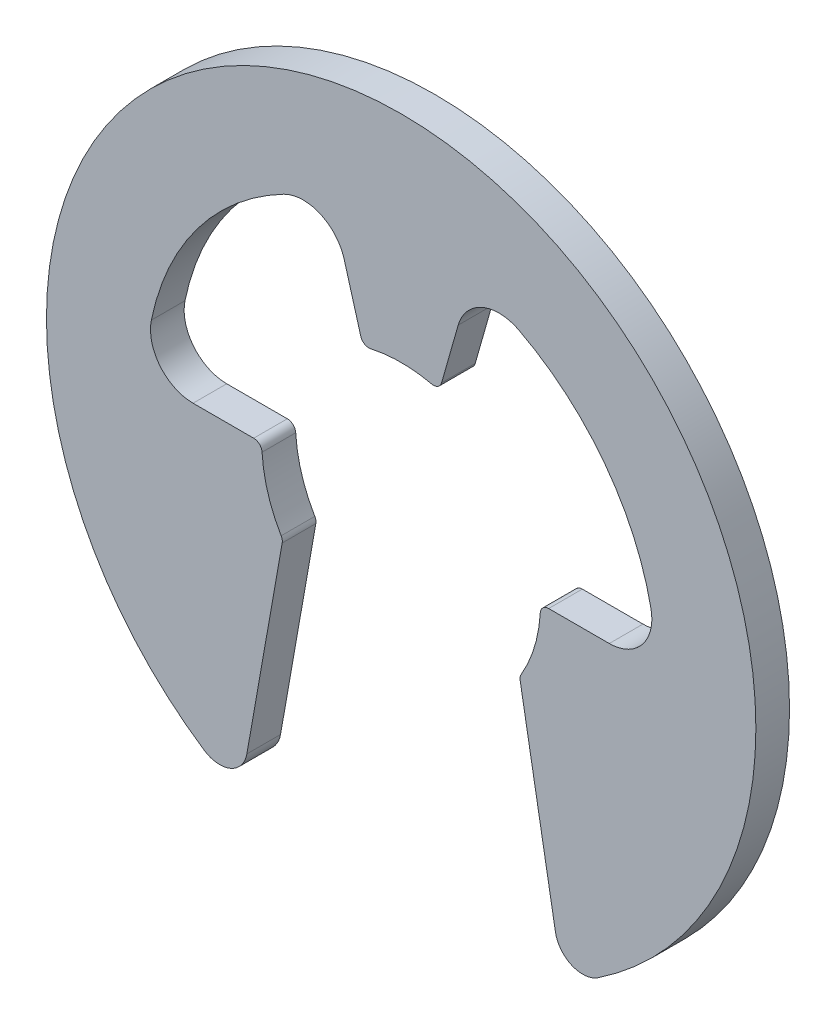
ISO-10303-21;
HEADER;
FILE_DESCRIPTION(('STEP AP214'),'2;1');
FILE_NAME('part.step','',(''),(''),'','','');
FILE_SCHEMA(('AUTOMOTIVE_DESIGN { 1 0 10303 214 1 1 1 1 }'));
ENDSEC;
DATA;
#1=APPLICATION_CONTEXT('core data for automotive mechanical design processes');
#2=APPLICATION_PROTOCOL_DEFINITION('international standard','automotive_design',2000,#1);
#3=PRODUCT_CONTEXT('',#1,'mechanical');
#4=PRODUCT('Part','Part','',(#3));
#5=PRODUCT_RELATED_PRODUCT_CATEGORY('part','',(#4));
#6=PRODUCT_DEFINITION_FORMATION('','',#4);
#7=PRODUCT_DEFINITION_CONTEXT('part definition',#1,'design');
#8=PRODUCT_DEFINITION('design','',#6,#7);
#9=PRODUCT_DEFINITION_SHAPE('','',#8);
#10=(LENGTH_UNIT() NAMED_UNIT(*) SI_UNIT(.MILLI.,.METRE.));
#11=(NAMED_UNIT(*) PLANE_ANGLE_UNIT() SI_UNIT($,.RADIAN.));
#12=(NAMED_UNIT(*) SI_UNIT($,.STERADIAN.) SOLID_ANGLE_UNIT());
#13=UNCERTAINTY_MEASURE_WITH_UNIT(LENGTH_MEASURE(1.E-05),#10,'distance_accuracy_value','');
#14=(GEOMETRIC_REPRESENTATION_CONTEXT(3) GLOBAL_UNCERTAINTY_ASSIGNED_CONTEXT((#13)) GLOBAL_UNIT_ASSIGNED_CONTEXT((#10,
#11,#12)) REPRESENTATION_CONTEXT('',''));
#15=CARTESIAN_POINT('',(0.,0.,0.));
#16=DIRECTION('',(0.,0.,1.));
#17=DIRECTION('',(1.,0.,0.));
#18=AXIS2_PLACEMENT_3D('',#15,#16,#17);
#19=CARTESIAN_POINT('',(-6.6929,0.,0.317500000000002));
#20=DIRECTION('',(0.,0.,1.));
#21=DIRECTION('',(1.,0.,0.));
#22=AXIS2_PLACEMENT_3D('',#19,#20,#21);
#23=PLANE('',#22);
#24=CARTESIAN_POINT('',(0.,0.,0.317500000000001));
#25=DIRECTION('',(0.,0.,1.));
#26=DIRECTION('',(-1.,0.,0.));
#27=AXIS2_PLACEMENT_3D('',#24,#25,#26);
#28=CIRCLE('',#27,2.6289);
#29=CARTESIAN_POINT('',(2.26450522532689,-1.33533939298862,0.317500000000001));
#30=VERTEX_POINT('',#29);
#31=CARTESIAN_POINT('',(2.62463373739829,-0.149709567198178,0.317500000000001));
#32=VERTEX_POINT('',#31);
#33=EDGE_CURVE('E349',#30,#32,#28,.T.);
#34=ORIENTED_EDGE('',*,*,#33,.F.);
#35=CARTESIAN_POINT('',(2.40125070994808,-1.41597582976329,0.3175));
#36=DIRECTION('',(0.,0.,1.));
#37=DIRECTION('',(1.,0.,0.));
#38=AXIS2_PLACEMENT_3D('',#35,#36,#37);
#39=CIRCLE('',#38,0.15875);
#40=CARTESIAN_POINT('',(2.24491247915739,-1.44354247796792,0.317500000000001));
#41=VERTEX_POINT('',#40);
#42=EDGE_CURVE('E293',#30,#41,#39,.T.);
#43=ORIENTED_EDGE('',*,*,#42,.T.);
#44=DIRECTION('',(-0.173648177666931,0.984807753012208,0.));
#45=VECTOR('',#44,1.);
#46=CARTESIAN_POINT('',(2.234565,-1.38485900754373,0.317500000000001));
#47=LINE('',#46,#45);
#48=CARTESIAN_POINT('',(2.911405825242,-5.22341407451373,0.317500000000001));
#49=VERTEX_POINT('',#48);
#50=EDGE_CURVE('E341',#49,#41,#47,.T.);
#51=ORIENTED_EDGE('',*,*,#50,.F.);
#52=CARTESIAN_POINT('',(3.42552097043256,-5.13276170322578,0.3175));
#53=DIRECTION('',(0.,0.,1.));
#54=DIRECTION('',(1.,0.,0.));
#55=AXIS2_PLACEMENT_3D('',#52,#53,#54);
#56=CIRCLE('',#55,0.5220462);
#57=CARTESIAN_POINT('',(3.71531558615245,-5.56698666293468,0.317499999999999));
#58=VERTEX_POINT('',#57);
#59=EDGE_CURVE('E264',#49,#58,#56,.T.);
#60=ORIENTED_EDGE('',*,*,#59,.T.);
#61=CARTESIAN_POINT('',(0.,0.,0.3175));
#62=DIRECTION('',(0.,0.,-1.));
#63=DIRECTION('',(-1.,0.,0.));
#64=AXIS2_PLACEMENT_3D('',#61,#62,#63);
#65=CIRCLE('',#64,6.6929);
#66=CARTESIAN_POINT('',(-3.71531558615245,-5.56698666293468,0.317500000000001));
#67=VERTEX_POINT('',#66);
#68=EDGE_CURVE('E228',#67,#58,#65,.T.);
#69=ORIENTED_EDGE('',*,*,#68,.F.);
#70=CARTESIAN_POINT('',(-3.42552097043256,-5.13276170322578,0.317500000000001));
#71=DIRECTION('',(0.,0.,1.));
#72=DIRECTION('',(1.,0.,0.));
#73=AXIS2_PLACEMENT_3D('',#70,#71,#72);
#74=CIRCLE('',#73,0.5220462);
#75=CARTESIAN_POINT('',(-2.911405825242,-5.22341407451373,0.317500000000001));
#76=VERTEX_POINT('',#75);
#77=EDGE_CURVE('E261',#67,#76,#74,.T.);
#78=ORIENTED_EDGE('',*,*,#77,.T.);
#79=DIRECTION('',(-0.173648177666931,-0.984807753012208,0.));
#80=VECTOR('',#79,1.);
#81=CARTESIAN_POINT('',(-2.234565,-1.38485900754373,0.317500000000001));
#82=LINE('',#81,#80);
#83=CARTESIAN_POINT('',(-2.24491247915739,-1.44354247796792,0.317500000000001));
#84=VERTEX_POINT('',#83);
#85=EDGE_CURVE('E338',#84,#76,#82,.T.);
#86=ORIENTED_EDGE('',*,*,#85,.F.);
#87=CARTESIAN_POINT('',(-2.40125070994808,-1.41597582976329,0.317500000000001));
#88=DIRECTION('',(0.,0.,1.));
#89=DIRECTION('',(1.,0.,0.));
#90=AXIS2_PLACEMENT_3D('',#87,#88,#89);
#91=CIRCLE('',#90,0.15875);
#92=CARTESIAN_POINT('',(-2.26450522532689,-1.33533939298862,0.317500000000001));
#93=VERTEX_POINT('',#92);
#94=EDGE_CURVE('E285',#84,#93,#91,.T.);
#95=ORIENTED_EDGE('',*,*,#94,.T.);
#96=CARTESIAN_POINT('',(0.,0.,0.317500000000001));
#97=DIRECTION('',(0.,0.,1.));
#98=DIRECTION('',(1.,0.,0.));
#99=AXIS2_PLACEMENT_3D('',#96,#97,#98);
#100=CIRCLE('',#99,2.62890000000003);
#101=CARTESIAN_POINT('',(-2.62463373739829,-0.149709567198178,0.317500000000001));
#102=VERTEX_POINT('',#101);
#103=EDGE_CURVE('E329',#102,#93,#100,.T.);
#104=ORIENTED_EDGE('',*,*,#103,.F.);
#105=CARTESIAN_POINT('',(-2.78312611284505,-0.158750000000001,0.317500000000001));
#106=DIRECTION('',(0.,0.,1.));
#107=DIRECTION('',(1.,0.,0.));
#108=AXIS2_PLACEMENT_3D('',#105,#106,#107);
#109=CIRCLE('',#108,0.15875);
#110=CARTESIAN_POINT('',(-2.78312611284505,0.,0.317500000000001));
#111=VERTEX_POINT('',#110);
#112=EDGE_CURVE('E283',#102,#111,#109,.T.);
#113=ORIENTED_EDGE('',*,*,#112,.T.);
#114=DIRECTION('',(1.,0.,0.));
#115=VECTOR('',#114,1.);
#116=CARTESIAN_POINT('',(-4.81125161290323,0.,0.317500000000001));
#117=LINE('',#116,#115);
#118=CARTESIAN_POINT('',(-3.92681141154804,0.,0.317500000000001));
#119=VERTEX_POINT('',#118);
#120=EDGE_CURVE('E339',#119,#111,#117,.T.);
#121=ORIENTED_EDGE('',*,*,#120,.F.);
#122=CARTESIAN_POINT('',(-3.92681141154804,0.803148,0.317500000000001));
#123=DIRECTION('',(0.,0.,1.));
#124=DIRECTION('',(1.,0.,0.));
#125=AXIS2_PLACEMENT_3D('',#122,#123,#124);
#126=CIRCLE('',#125,0.803148);
#127=CARTESIAN_POINT('',(-4.71366999509587,0.964083637448945,0.317500000000001));
#128=VERTEX_POINT('',#127);
#129=EDGE_CURVE('E254',#119,#128,#126,.F.);
#130=ORIENTED_EDGE('',*,*,#129,.T.);
#131=CARTESIAN_POINT('',(0.,0.,0.317500000000001));
#132=DIRECTION('',(0.,0.,1.));
#133=DIRECTION('',(1.,0.,0.));
#134=AXIS2_PLACEMENT_3D('',#131,#132,#133);
#135=CIRCLE('',#134,4.81125161290323);
#136=CARTESIAN_POINT('',(-2.21811764416981,4.26943745700607,0.317500000000001));
#137=VERTEX_POINT('',#136);
#138=EDGE_CURVE('E343',#137,#128,#135,.T.);
#139=ORIENTED_EDGE('',*,*,#138,.F.);
#140=CARTESIAN_POINT('',(-1.84784460650494,3.55673514363643,0.317500000000001));
#141=DIRECTION('',(0.,0.,1.));
#142=DIRECTION('',(1.,0.,0.));
#143=AXIS2_PLACEMENT_3D('',#140,#141,#142);
#144=CIRCLE('',#143,0.803148);
#145=CARTESIAN_POINT('',(-1.07540159458678,3.77668628194401,0.317500000000001));
#146=VERTEX_POINT('',#145);
#147=EDGE_CURVE('E249',#137,#146,#144,.F.);
#148=ORIENTED_EDGE('',*,*,#147,.T.);
#149=DIRECTION('',(-0.273861278752583,0.961769203083567,0.));
#150=VECTOR('',#149,1.);
#151=CARTESIAN_POINT('',(-0.719953915712665,2.52839505798639,0.317500000000001));
#152=LINE('',#151,#150);
#153=CARTESIAN_POINT('',(-0.762190476193451,2.67672498363205,0.317500000000001));
#154=VERTEX_POINT('',#153);
#155=EDGE_CURVE('E443',#154,#146,#152,.T.);
#156=ORIENTED_EDGE('',*,*,#155,.F.);
#157=CARTESIAN_POINT('',(-0.609509615203935,2.72020046163402,0.317500000000001));
#158=DIRECTION('',(0.,0.,1.));
#159=DIRECTION('',(1.,0.,0.));
#160=AXIS2_PLACEMENT_3D('',#157,#158,#159);
#161=CIRCLE('',#160,0.15875);
#162=CARTESIAN_POINT('',(-0.57479950044289,2.56529155151819,0.317500000000001));
#163=VERTEX_POINT('',#162);
#164=EDGE_CURVE('E287',#154,#163,#161,.T.);
#165=ORIENTED_EDGE('',*,*,#164,.T.);
#166=CARTESIAN_POINT('',(0.,0.,0.317500000000001));
#167=DIRECTION('',(0.,0.,1.));
#168=DIRECTION('',(-1.,0.,0.));
#169=AXIS2_PLACEMENT_3D('',#166,#167,#168);
#170=CIRCLE('',#169,2.6289);
#171=CARTESIAN_POINT('',(0.57479950044289,2.56529155151819,0.317500000000001));
#172=VERTEX_POINT('',#171);
#173=EDGE_CURVE('E433',#172,#163,#170,.T.);
#174=ORIENTED_EDGE('',*,*,#173,.F.);
#175=CARTESIAN_POINT('',(0.609509615203935,2.72020046163402,0.317500000000001));
#176=DIRECTION('',(0.,0.,1.));
#177=DIRECTION('',(1.,0.,0.));
#178=AXIS2_PLACEMENT_3D('',#175,#176,#177);
#179=CIRCLE('',#178,0.15875);
#180=CARTESIAN_POINT('',(0.762190476193451,2.67672498363205,0.317500000000001));
#181=VERTEX_POINT('',#180);
#182=EDGE_CURVE('E289',#172,#181,#179,.T.);
#183=ORIENTED_EDGE('',*,*,#182,.T.);
#184=DIRECTION('',(-0.273861278752583,-0.961769203083567,0.));
#185=VECTOR('',#184,1.);
#186=CARTESIAN_POINT('',(0.719953915712665,2.52839505798639,0.317500000000001));
#187=LINE('',#186,#185);
#188=CARTESIAN_POINT('',(1.07540159458678,3.77668628194401,0.317500000000001));
#189=VERTEX_POINT('',#188);
#190=EDGE_CURVE('E356',#189,#181,#187,.T.);
#191=ORIENTED_EDGE('',*,*,#190,.F.);
#192=CARTESIAN_POINT('',(1.84784460650494,3.55673514363643,0.3175));
#193=DIRECTION('',(0.,0.,1.));
#194=DIRECTION('',(1.,0.,0.));
#195=AXIS2_PLACEMENT_3D('',#192,#193,#194);
#196=CIRCLE('',#195,0.803148);
#197=CARTESIAN_POINT('',(2.21811764416981,4.26943745700607,0.317500000000001));
#198=VERTEX_POINT('',#197);
#199=EDGE_CURVE('E209',#189,#198,#196,.F.);
#200=ORIENTED_EDGE('',*,*,#199,.T.);
#201=CARTESIAN_POINT('',(0.,0.,0.317500000000001));
#202=DIRECTION('',(0.,0.,1.));
#203=DIRECTION('',(1.,0.,0.));
#204=AXIS2_PLACEMENT_3D('',#201,#202,#203);
#205=CIRCLE('',#204,4.81125161290323);
#206=CARTESIAN_POINT('',(4.71366999509587,0.964083637448945,0.317500000000001));
#207=VERTEX_POINT('',#206);
#208=EDGE_CURVE('E354',#207,#198,#205,.T.);
#209=ORIENTED_EDGE('',*,*,#208,.F.);
#210=CARTESIAN_POINT('',(3.92681141154804,0.803148,0.3175));
#211=DIRECTION('',(0.,0.,1.));
#212=DIRECTION('',(1.,0.,0.));
#213=AXIS2_PLACEMENT_3D('',#210,#211,#212);
#214=CIRCLE('',#213,0.803148);
#215=CARTESIAN_POINT('',(3.92681141154804,0.,0.317500000000001));
#216=VERTEX_POINT('',#215);
#217=EDGE_CURVE('E210',#207,#216,#214,.F.);
#218=ORIENTED_EDGE('',*,*,#217,.T.);
#219=DIRECTION('',(1.,0.,0.));
#220=VECTOR('',#219,1.);
#221=CARTESIAN_POINT('',(4.81125161290323,0.,0.317500000000001));
#222=LINE('',#221,#220);
#223=CARTESIAN_POINT('',(2.78312611284505,0.,0.317500000000001));
#224=VERTEX_POINT('',#223);
#225=EDGE_CURVE('E352',#224,#216,#222,.T.);
#226=ORIENTED_EDGE('',*,*,#225,.F.);
#227=CARTESIAN_POINT('',(2.78312611284505,-0.158750000000001,0.3175));
#228=DIRECTION('',(0.,0.,1.));
#229=DIRECTION('',(1.,0.,0.));
#230=AXIS2_PLACEMENT_3D('',#227,#228,#229);
#231=CIRCLE('',#230,0.15875);
#232=EDGE_CURVE('E291',#224,#32,#231,.T.);
#233=ORIENTED_EDGE('',*,*,#232,.T.);
#234=EDGE_LOOP('',(#34,#43,#51,#60,#69,#78,#86,#95,#104,#113,#121,#130,#139,#148,#156,#165,#174,
#183,#191,#200,#209,#218,#226,#233));
#235=FACE_BOUND('',#234,.T.);
#236=ADVANCED_FACE('F37',(#235),#23,.T.);
#237=CARTESIAN_POINT('',(0.,0.,-0.317500000000001));
#238=DIRECTION('',(0.,0.,-1.));
#239=DIRECTION('',(-1.,0.,0.));
#240=AXIS2_PLACEMENT_3D('',#237,#238,#239);
#241=CYLINDRICAL_SURFACE('',#240,6.6929);
#242=ORIENTED_EDGE('',*,*,#68,.T.);
#243=DIRECTION('',(0.,0.,-1.));
#244=VECTOR('',#243,1.);
#245=CARTESIAN_POINT('',(3.71531558615245,-5.56698666293468,-0.317500000000002));
#246=LINE('',#245,#244);
#247=CARTESIAN_POINT('',(3.71531558615245,-5.56698666293468,-0.317500000000001));
#248=VERTEX_POINT('',#247);
#249=EDGE_CURVE('E269',#58,#248,#246,.T.);
#250=ORIENTED_EDGE('',*,*,#249,.T.);
#251=CARTESIAN_POINT('',(0.,0.,-0.3175));
#252=DIRECTION('',(0.,0.,-1.));
#253=DIRECTION('',(-1.,0.,0.));
#254=AXIS2_PLACEMENT_3D('',#251,#252,#253);
#255=CIRCLE('',#254,6.6929);
#256=CARTESIAN_POINT('',(-3.71531558615245,-5.56698666293468,-0.317499999999999));
#257=VERTEX_POINT('',#256);
#258=EDGE_CURVE('E381',#257,#248,#255,.T.);
#259=ORIENTED_EDGE('',*,*,#258,.F.);
#260=DIRECTION('',(0.,0.,-1.));
#261=VECTOR('',#260,1.);
#262=CARTESIAN_POINT('',(-3.71531558615245,-5.56698666293468,-0.317500000000001));
#263=LINE('',#262,#261);
#264=EDGE_CURVE('E266',#257,#67,#263,.F.);
#265=ORIENTED_EDGE('',*,*,#264,.T.);
#266=EDGE_LOOP('',(#242,#250,#259,#265));
#267=FACE_BOUND('',#266,.T.);
#268=ADVANCED_FACE('F387',(#267),#241,.T.);
#269=CARTESIAN_POINT('',(-6.6929,0.,-0.317499999999999));
#270=DIRECTION('',(0.,0.,-1.));
#271=DIRECTION('',(-1.,0.,0.));
#272=AXIS2_PLACEMENT_3D('',#269,#270,#271);
#273=PLANE('',#272);
#274=DIRECTION('',(-0.173648177666931,0.984807753012208,0.));
#275=VECTOR('',#274,1.);
#276=CARTESIAN_POINT('',(2.234565,-1.38485900754373,-0.317499999999999));
#277=LINE('',#276,#275);
#278=CARTESIAN_POINT('',(2.911405825242,-5.22341407451373,-0.317499999999999));
#279=VERTEX_POINT('',#278);
#280=CARTESIAN_POINT('',(2.24491247915739,-1.44354247796792,-0.317499999999999));
#281=VERTEX_POINT('',#280);
#282=EDGE_CURVE('E373',#279,#281,#277,.T.);
#283=ORIENTED_EDGE('',*,*,#282,.T.);
#284=CARTESIAN_POINT('',(2.40125070994808,-1.41597582976329,-0.317500000000001));
#285=DIRECTION('',(0.,0.,-1.));
#286=DIRECTION('',(-1.,0.,0.));
#287=AXIS2_PLACEMENT_3D('',#284,#285,#286);
#288=CIRCLE('',#287,0.15875);
#289=CARTESIAN_POINT('',(2.26450522532689,-1.33533939298862,-0.317499999999999));
#290=VERTEX_POINT('',#289);
#291=EDGE_CURVE('E306',#281,#290,#288,.T.);
#292=ORIENTED_EDGE('',*,*,#291,.T.);
#293=CARTESIAN_POINT('',(0.,0.,-0.317499999999999));
#294=DIRECTION('',(0.,0.,1.));
#295=DIRECTION('',(-1.,0.,0.));
#296=AXIS2_PLACEMENT_3D('',#293,#294,#295);
#297=CIRCLE('',#296,2.6289);
#298=CARTESIAN_POINT('',(2.62463373739829,-0.149709567198178,-0.317499999999999));
#299=VERTEX_POINT('',#298);
#300=EDGE_CURVE('E375',#290,#299,#297,.T.);
#301=ORIENTED_EDGE('',*,*,#300,.T.);
#302=CARTESIAN_POINT('',(2.78312611284505,-0.158750000000001,-0.317500000000001));
#303=DIRECTION('',(0.,0.,-1.));
#304=DIRECTION('',(-1.,0.,0.));
#305=AXIS2_PLACEMENT_3D('',#302,#303,#304);
#306=CIRCLE('',#305,0.15875);
#307=CARTESIAN_POINT('',(2.78312611284505,0.,-0.317499999999999));
#308=VERTEX_POINT('',#307);
#309=EDGE_CURVE('E304',#299,#308,#306,.T.);
#310=ORIENTED_EDGE('',*,*,#309,.T.);
#311=DIRECTION('',(1.,0.,0.));
#312=VECTOR('',#311,1.);
#313=CARTESIAN_POINT('',(4.81125161290323,0.,-0.317499999999999));
#314=LINE('',#313,#312);
#315=CARTESIAN_POINT('',(3.92681141154804,0.,-0.317499999999999));
#316=VERTEX_POINT('',#315);
#317=EDGE_CURVE('E204',#308,#316,#314,.T.);
#318=ORIENTED_EDGE('',*,*,#317,.T.);
#319=CARTESIAN_POINT('',(3.92681141154804,0.803148,-0.317500000000001));
#320=DIRECTION('',(0.,0.,-1.));
#321=DIRECTION('',(-1.,0.,0.));
#322=AXIS2_PLACEMENT_3D('',#319,#320,#321);
#323=CIRCLE('',#322,0.803148);
#324=CARTESIAN_POINT('',(4.71366999509587,0.964083637448945,-0.317499999999999));
#325=VERTEX_POINT('',#324);
#326=EDGE_CURVE('E197',#316,#325,#323,.F.);
#327=ORIENTED_EDGE('',*,*,#326,.T.);
#328=CARTESIAN_POINT('',(0.,0.,-0.317499999999999));
#329=DIRECTION('',(0.,0.,1.));
#330=DIRECTION('',(1.,0.,0.));
#331=AXIS2_PLACEMENT_3D('',#328,#329,#330);
#332=CIRCLE('',#331,4.81125161290323);
#333=CARTESIAN_POINT('',(2.21811764416981,4.26943745700607,-0.317499999999999));
#334=VERTEX_POINT('',#333);
#335=EDGE_CURVE('E201',#325,#334,#332,.T.);
#336=ORIENTED_EDGE('',*,*,#335,.T.);
#337=CARTESIAN_POINT('',(1.84784460650494,3.55673514363643,-0.317500000000001));
#338=DIRECTION('',(0.,0.,-1.));
#339=DIRECTION('',(-1.,0.,0.));
#340=AXIS2_PLACEMENT_3D('',#337,#338,#339);
#341=CIRCLE('',#340,0.803148);
#342=CARTESIAN_POINT('',(1.07540159458678,3.77668628194401,-0.317499999999999));
#343=VERTEX_POINT('',#342);
#344=EDGE_CURVE('E247',#334,#343,#341,.F.);
#345=ORIENTED_EDGE('',*,*,#344,.T.);
#346=DIRECTION('',(-0.273861278752583,-0.961769203083567,0.));
#347=VECTOR('',#346,1.);
#348=CARTESIAN_POINT('',(0.719953915712665,2.52839505798639,-0.317499999999999));
#349=LINE('',#348,#347);
#350=CARTESIAN_POINT('',(0.762190476193451,2.67672498363205,-0.317499999999999));
#351=VERTEX_POINT('',#350);
#352=EDGE_CURVE('E220',#343,#351,#349,.T.);
#353=ORIENTED_EDGE('',*,*,#352,.T.);
#354=CARTESIAN_POINT('',(0.609509615203935,2.72020046163402,-0.317500000000001));
#355=DIRECTION('',(0.,0.,-1.));
#356=DIRECTION('',(-1.,0.,0.));
#357=AXIS2_PLACEMENT_3D('',#354,#355,#356);
#358=CIRCLE('',#357,0.15875);
#359=CARTESIAN_POINT('',(0.57479950044289,2.56529155151819,-0.317499999999999));
#360=VERTEX_POINT('',#359);
#361=EDGE_CURVE('E302',#351,#360,#358,.T.);
#362=ORIENTED_EDGE('',*,*,#361,.T.);
#363=CARTESIAN_POINT('',(0.,0.,-0.317499999999999));
#364=DIRECTION('',(0.,0.,1.));
#365=DIRECTION('',(-1.,0.,0.));
#366=AXIS2_PLACEMENT_3D('',#363,#364,#365);
#367=CIRCLE('',#366,2.6289);
#368=CARTESIAN_POINT('',(-0.57479950044289,2.56529155151819,-0.317499999999999));
#369=VERTEX_POINT('',#368);
#370=EDGE_CURVE('E359',#360,#369,#367,.T.);
#371=ORIENTED_EDGE('',*,*,#370,.T.);
#372=CARTESIAN_POINT('',(-0.609509615203935,2.72020046163402,-0.317500000000001));
#373=DIRECTION('',(0.,0.,-1.));
#374=DIRECTION('',(-1.,0.,0.));
#375=AXIS2_PLACEMENT_3D('',#372,#373,#374);
#376=CIRCLE('',#375,0.15875);
#377=CARTESIAN_POINT('',(-0.762190476193451,2.67672498363205,-0.317499999999999));
#378=VERTEX_POINT('',#377);
#379=EDGE_CURVE('E300',#369,#378,#376,.T.);
#380=ORIENTED_EDGE('',*,*,#379,.T.);
#381=DIRECTION('',(-0.273861278752583,0.961769203083567,0.));
#382=VECTOR('',#381,1.);
#383=CARTESIAN_POINT('',(-0.719953915712665,2.52839505798639,-0.317499999999999));
#384=LINE('',#383,#382);
#385=CARTESIAN_POINT('',(-1.07540159458678,3.77668628194401,-0.317499999999999));
#386=VERTEX_POINT('',#385);
#387=EDGE_CURVE('E362',#378,#386,#384,.T.);
#388=ORIENTED_EDGE('',*,*,#387,.T.);
#389=CARTESIAN_POINT('',(-1.84784460650494,3.55673514363643,-0.3175));
#390=DIRECTION('',(0.,0.,-1.));
#391=DIRECTION('',(-1.,0.,0.));
#392=AXIS2_PLACEMENT_3D('',#389,#390,#391);
#393=CIRCLE('',#392,0.803148);
#394=CARTESIAN_POINT('',(-2.21811764416981,4.26943745700607,-0.317499999999999));
#395=VERTEX_POINT('',#394);
#396=EDGE_CURVE('E252',#386,#395,#393,.F.);
#397=ORIENTED_EDGE('',*,*,#396,.T.);
#398=CARTESIAN_POINT('',(0.,0.,-0.317499999999999));
#399=DIRECTION('',(0.,0.,1.));
#400=DIRECTION('',(1.,0.,0.));
#401=AXIS2_PLACEMENT_3D('',#398,#399,#400);
#402=CIRCLE('',#401,4.81125161290323);
#403=CARTESIAN_POINT('',(-4.71366999509587,0.964083637448945,-0.317499999999999));
#404=VERTEX_POINT('',#403);
#405=EDGE_CURVE('E364',#395,#404,#402,.T.);
#406=ORIENTED_EDGE('',*,*,#405,.T.);
#407=CARTESIAN_POINT('',(-3.92681141154804,0.803148,-0.3175));
#408=DIRECTION('',(0.,0.,-1.));
#409=DIRECTION('',(-1.,0.,0.));
#410=AXIS2_PLACEMENT_3D('',#407,#408,#409);
#411=CIRCLE('',#410,0.803148);
#412=CARTESIAN_POINT('',(-3.92681141154804,0.,-0.317499999999999));
#413=VERTEX_POINT('',#412);
#414=EDGE_CURVE('E256',#404,#413,#411,.F.);
#415=ORIENTED_EDGE('',*,*,#414,.T.);
#416=DIRECTION('',(1.,0.,0.));
#417=VECTOR('',#416,1.);
#418=CARTESIAN_POINT('',(-4.81125161290323,0.,-0.317499999999999));
#419=LINE('',#418,#417);
#420=CARTESIAN_POINT('',(-2.78312611284505,0.,-0.317499999999999));
#421=VERTEX_POINT('',#420);
#422=EDGE_CURVE('E367',#413,#421,#419,.T.);
#423=ORIENTED_EDGE('',*,*,#422,.T.);
#424=CARTESIAN_POINT('',(-2.78312611284505,-0.158750000000001,-0.3175));
#425=DIRECTION('',(0.,0.,-1.));
#426=DIRECTION('',(-1.,0.,0.));
#427=AXIS2_PLACEMENT_3D('',#424,#425,#426);
#428=CIRCLE('',#427,0.15875);
#429=CARTESIAN_POINT('',(-2.62463373739829,-0.149709567198178,-0.317499999999999));
#430=VERTEX_POINT('',#429);
#431=EDGE_CURVE('E297',#421,#430,#428,.T.);
#432=ORIENTED_EDGE('',*,*,#431,.T.);
#433=CARTESIAN_POINT('',(0.,0.,-0.317499999999999));
#434=DIRECTION('',(0.,0.,1.));
#435=DIRECTION('',(1.,0.,0.));
#436=AXIS2_PLACEMENT_3D('',#433,#434,#435);
#437=CIRCLE('',#436,2.62890000000003);
#438=CARTESIAN_POINT('',(-2.26450522532689,-1.33533939298862,-0.317499999999999));
#439=VERTEX_POINT('',#438);
#440=EDGE_CURVE('E330',#430,#439,#437,.T.);
#441=ORIENTED_EDGE('',*,*,#440,.T.);
#442=CARTESIAN_POINT('',(-2.40125070994808,-1.41597582976329,-0.3175));
#443=DIRECTION('',(0.,0.,-1.));
#444=DIRECTION('',(-1.,0.,0.));
#445=AXIS2_PLACEMENT_3D('',#442,#443,#444);
#446=CIRCLE('',#445,0.15875);
#447=CARTESIAN_POINT('',(-2.24491247915739,-1.44354247796792,-0.317499999999999));
#448=VERTEX_POINT('',#447);
#449=EDGE_CURVE('E52',#439,#448,#446,.T.);
#450=ORIENTED_EDGE('',*,*,#449,.T.);
#451=DIRECTION('',(-0.173648177666931,-0.984807753012208,0.));
#452=VECTOR('',#451,1.);
#453=CARTESIAN_POINT('',(-2.234565,-1.38485900754373,-0.317499999999999));
#454=LINE('',#453,#452);
#455=CARTESIAN_POINT('',(-2.911405825242,-5.22341407451373,-0.317499999999999));
#456=VERTEX_POINT('',#455);
#457=EDGE_CURVE('E371',#448,#456,#454,.T.);
#458=ORIENTED_EDGE('',*,*,#457,.T.);
#459=CARTESIAN_POINT('',(-3.42552097043256,-5.13276170322578,-0.3175));
#460=DIRECTION('',(0.,0.,-1.));
#461=DIRECTION('',(-1.,0.,0.));
#462=AXIS2_PLACEMENT_3D('',#459,#460,#461);
#463=CIRCLE('',#462,0.5220462);
#464=EDGE_CURVE('E271',#456,#257,#463,.T.);
#465=ORIENTED_EDGE('',*,*,#464,.T.);
#466=ORIENTED_EDGE('',*,*,#258,.T.);
#467=CARTESIAN_POINT('',(3.42552097043256,-5.13276170322578,-0.317500000000001));
#468=DIRECTION('',(0.,0.,-1.));
#469=DIRECTION('',(-1.,0.,0.));
#470=AXIS2_PLACEMENT_3D('',#467,#468,#469);
#471=CIRCLE('',#470,0.5220462);
#472=EDGE_CURVE('E273',#248,#279,#471,.T.);
#473=ORIENTED_EDGE('',*,*,#472,.T.);
#474=EDGE_LOOP('',(#283,#292,#301,#310,#318,#327,#336,#345,#353,#362,#371,#380,#388,#397,#406,
#415,#423,#432,#441,#450,#458,#465,#466,#473));
#475=FACE_BOUND('',#474,.T.);
#476=ADVANCED_FACE('F200',(#475),#273,.T.);
#477=CARTESIAN_POINT('',(0.,0.,-0.317499999999999));
#478=DIRECTION('',(0.,0.,1.));
#479=DIRECTION('',(1.,0.,0.));
#480=AXIS2_PLACEMENT_3D('',#477,#478,#479);
#481=CYLINDRICAL_SURFACE('',#480,2.6289);
#482=ORIENTED_EDGE('',*,*,#370,.F.);
#483=DIRECTION('',(0.,0.,1.));
#484=VECTOR('',#483,1.);
#485=CARTESIAN_POINT('',(0.57479950044289,2.56529155151819,-0.317499999999999));
#486=LINE('',#485,#484);
#487=EDGE_CURVE('E313',#360,#172,#486,.T.);
#488=ORIENTED_EDGE('',*,*,#487,.T.);
#489=ORIENTED_EDGE('',*,*,#173,.T.);
#490=DIRECTION('',(0.,0.,1.));
#491=VECTOR('',#490,1.);
#492=CARTESIAN_POINT('',(-0.57479950044289,2.56529155151819,-0.317499999999999));
#493=LINE('',#492,#491);
#494=EDGE_CURVE('E311',#163,#369,#493,.F.);
#495=ORIENTED_EDGE('',*,*,#494,.T.);
#496=EDGE_LOOP('',(#482,#488,#489,#495));
#497=FACE_BOUND('',#496,.T.);
#498=ADVANCED_FACE('F429',(#497),#481,.F.);
#499=CARTESIAN_POINT('',(0.719953915712665,2.52839505798639,-0.317499999999999));
#500=DIRECTION('',(-0.961769203083567,0.273861278752583,0.));
#501=DIRECTION('',(-0.273861278752583,-0.961769203083567,0.));
#502=AXIS2_PLACEMENT_3D('',#499,#500,#501);
#503=PLANE('',#502);
#504=ORIENTED_EDGE('',*,*,#190,.T.);
#505=DIRECTION('',(0.,0.,1.));
#506=VECTOR('',#505,1.);
#507=CARTESIAN_POINT('',(0.762190476193451,2.67672498363205,-0.317499999999999));
#508=LINE('',#507,#506);
#509=EDGE_CURVE('E316',#181,#351,#508,.F.);
#510=ORIENTED_EDGE('',*,*,#509,.T.);
#511=ORIENTED_EDGE('',*,*,#352,.F.);
#512=DIRECTION('',(0.,0.,-1.));
#513=VECTOR('',#512,1.);
#514=CARTESIAN_POINT('',(1.07540159458678,3.77668628194401,0.317500000000001));
#515=LINE('',#514,#513);
#516=EDGE_CURVE('E226',#343,#189,#515,.F.);
#517=ORIENTED_EDGE('',*,*,#516,.T.);
#518=EDGE_LOOP('',(#504,#510,#511,#517));
#519=FACE_BOUND('',#518,.T.);
#520=ADVANCED_FACE('F421',(#519),#503,.F.);
#521=CARTESIAN_POINT('',(0.,0.,-0.317499999999999));
#522=DIRECTION('',(0.,0.,1.));
#523=DIRECTION('',(1.,0.,0.));
#524=AXIS2_PLACEMENT_3D('',#521,#522,#523);
#525=CYLINDRICAL_SURFACE('',#524,4.81125161290323);
#526=ORIENTED_EDGE('',*,*,#335,.F.);
#527=DIRECTION('',(0.,0.,1.));
#528=VECTOR('',#527,1.);
#529=CARTESIAN_POINT('',(4.71366999509587,0.964083637448945,-0.317499999999999));
#530=LINE('',#529,#528);
#531=EDGE_CURVE('E216',#325,#207,#530,.T.);
#532=ORIENTED_EDGE('',*,*,#531,.T.);
#533=ORIENTED_EDGE('',*,*,#208,.T.);
#534=DIRECTION('',(0.,0.,1.));
#535=VECTOR('',#534,1.);
#536=CARTESIAN_POINT('',(2.21811764416981,4.26943745700607,-0.317499999999999));
#537=LINE('',#536,#535);
#538=EDGE_CURVE('E219',#198,#334,#537,.F.);
#539=ORIENTED_EDGE('',*,*,#538,.T.);
#540=EDGE_LOOP('',(#526,#532,#533,#539));
#541=FACE_BOUND('',#540,.T.);
#542=ADVANCED_FACE('F214',(#541),#525,.F.);
#543=CARTESIAN_POINT('',(4.81125161290323,0.,-0.317499999999999));
#544=DIRECTION('',(0.,-1.,0.));
#545=DIRECTION('',(1.,0.,0.));
#546=AXIS2_PLACEMENT_3D('',#543,#544,#545);
#547=PLANE('',#546);
#548=ORIENTED_EDGE('',*,*,#317,.F.);
#549=DIRECTION('',(0.,0.,1.));
#550=VECTOR('',#549,1.);
#551=CARTESIAN_POINT('',(2.78312611284505,0.,-0.317499999999999));
#552=LINE('',#551,#550);
#553=EDGE_CURVE('E308',#308,#224,#552,.T.);
#554=ORIENTED_EDGE('',*,*,#553,.T.);
#555=ORIENTED_EDGE('',*,*,#225,.T.);
#556=DIRECTION('',(0.,0.,-1.));
#557=VECTOR('',#556,1.);
#558=CARTESIAN_POINT('',(3.92681141154804,0.,-0.317499999999999));
#559=LINE('',#558,#557);
#560=EDGE_CURVE('E224',#216,#316,#559,.T.);
#561=ORIENTED_EDGE('',*,*,#560,.T.);
#562=EDGE_LOOP('',(#548,#554,#555,#561));
#563=FACE_BOUND('',#562,.T.);
#564=ADVANCED_FACE('F412',(#563),#547,.F.);
#565=CARTESIAN_POINT('',(0.,0.,-0.317499999999999));
#566=DIRECTION('',(0.,0.,1.));
#567=DIRECTION('',(1.,0.,0.));
#568=AXIS2_PLACEMENT_3D('',#565,#566,#567);
#569=CYLINDRICAL_SURFACE('',#568,2.6289);
#570=ORIENTED_EDGE('',*,*,#300,.F.);
#571=DIRECTION('',(0.,0.,1.));
#572=VECTOR('',#571,1.);
#573=CARTESIAN_POINT('',(2.26450522532689,-1.33533939298862,-0.317499999999999));
#574=LINE('',#573,#572);
#575=EDGE_CURVE('E280',#290,#30,#574,.T.);
#576=ORIENTED_EDGE('',*,*,#575,.T.);
#577=ORIENTED_EDGE('',*,*,#33,.T.);
#578=DIRECTION('',(0.,0.,1.));
#579=VECTOR('',#578,1.);
#580=CARTESIAN_POINT('',(2.62463373739829,-0.149709567198178,-0.317499999999999));
#581=LINE('',#580,#579);
#582=EDGE_CURVE('E278',#32,#299,#581,.F.);
#583=ORIENTED_EDGE('',*,*,#582,.T.);
#584=EDGE_LOOP('',(#570,#576,#577,#583));
#585=FACE_BOUND('',#584,.T.);
#586=ADVANCED_FACE('F406',(#585),#569,.F.);
#587=CARTESIAN_POINT('',(2.234565,-1.38485900754373,-0.317499999999999));
#588=DIRECTION('',(0.984807753012208,0.173648177666931,0.));
#589=DIRECTION('',(-0.173648177666931,0.984807753012208,0.));
#590=AXIS2_PLACEMENT_3D('',#587,#588,#589);
#591=PLANE('',#590);
#592=ORIENTED_EDGE('',*,*,#50,.T.);
#593=DIRECTION('',(0.,0.,1.));
#594=VECTOR('',#593,1.);
#595=CARTESIAN_POINT('',(2.24491247915739,-1.44354247796792,-0.317499999999999));
#596=LINE('',#595,#594);
#597=EDGE_CURVE('E295',#41,#281,#596,.F.);
#598=ORIENTED_EDGE('',*,*,#597,.T.);
#599=ORIENTED_EDGE('',*,*,#282,.F.);
#600=DIRECTION('',(0.,0.,1.));
#601=VECTOR('',#600,1.);
#602=CARTESIAN_POINT('',(2.911405825242,-5.22341407451373,0.317500000000001));
#603=LINE('',#602,#601);
#604=EDGE_CURVE('E258',#279,#49,#603,.T.);
#605=ORIENTED_EDGE('',*,*,#604,.T.);
#606=EDGE_LOOP('',(#592,#598,#599,#605));
#607=FACE_BOUND('',#606,.T.);
#608=ADVANCED_FACE('F397',(#607),#591,.F.);
#609=CARTESIAN_POINT('',(-2.234565,-1.38485900754373,-0.317499999999999));
#610=DIRECTION('',(-0.984807753012208,0.173648177666931,0.));
#611=DIRECTION('',(-0.173648177666931,-0.984807753012208,0.));
#612=AXIS2_PLACEMENT_3D('',#609,#610,#611);
#613=PLANE('',#612);
#614=ORIENTED_EDGE('',*,*,#457,.F.);
#615=DIRECTION('',(0.,0.,1.));
#616=VECTOR('',#615,1.);
#617=CARTESIAN_POINT('',(-2.24491247915739,-1.44354247796792,-0.317499999999999));
#618=LINE('',#617,#616);
#619=EDGE_CURVE('E321',#448,#84,#618,.T.);
#620=ORIENTED_EDGE('',*,*,#619,.T.);
#621=ORIENTED_EDGE('',*,*,#85,.T.);
#622=DIRECTION('',(0.,0.,1.));
#623=VECTOR('',#622,1.);
#624=CARTESIAN_POINT('',(-2.911405825242,-5.22341407451373,-0.317499999999999));
#625=LINE('',#624,#623);
#626=EDGE_CURVE('E275',#76,#456,#625,.F.);
#627=ORIENTED_EDGE('',*,*,#626,.T.);
#628=EDGE_LOOP('',(#614,#620,#621,#627));
#629=FACE_BOUND('',#628,.T.);
#630=ADVANCED_FACE('F465',(#629),#613,.F.);
#631=CARTESIAN_POINT('',(0.,0.,-0.317499999999999));
#632=DIRECTION('',(0.,0.,1.));
#633=DIRECTION('',(1.,0.,0.));
#634=AXIS2_PLACEMENT_3D('',#631,#632,#633);
#635=CYLINDRICAL_SURFACE('',#634,2.62890000000003);
#636=ORIENTED_EDGE('',*,*,#103,.T.);
#637=DIRECTION('',(0.,0.,1.));
#638=VECTOR('',#637,1.);
#639=CARTESIAN_POINT('',(-2.26450522532689,-1.33533939298862,-0.317499999999999));
#640=LINE('',#639,#638);
#641=EDGE_CURVE('E45',#93,#439,#640,.F.);
#642=ORIENTED_EDGE('',*,*,#641,.T.);
#643=ORIENTED_EDGE('',*,*,#440,.F.);
#644=DIRECTION('',(0.,0.,1.));
#645=VECTOR('',#644,1.);
#646=CARTESIAN_POINT('',(-2.62463373739829,-0.149709567198178,-0.317499999999999));
#647=LINE('',#646,#645);
#648=EDGE_CURVE('E324',#430,#102,#647,.T.);
#649=ORIENTED_EDGE('',*,*,#648,.T.);
#650=EDGE_LOOP('',(#636,#642,#643,#649));
#651=FACE_BOUND('',#650,.T.);
#652=ADVANCED_FACE('F328',(#651),#635,.F.);
#653=CARTESIAN_POINT('',(-4.81125161290323,0.,-0.317499999999999));
#654=DIRECTION('',(0.,-1.,0.));
#655=DIRECTION('',(1.,0.,0.));
#656=AXIS2_PLACEMENT_3D('',#653,#654,#655);
#657=PLANE('',#656);
#658=ORIENTED_EDGE('',*,*,#120,.T.);
#659=DIRECTION('',(0.,0.,1.));
#660=VECTOR('',#659,1.);
#661=CARTESIAN_POINT('',(-2.78312611284505,0.,-0.317499999999999));
#662=LINE('',#661,#660);
#663=EDGE_CURVE('E11',#111,#421,#662,.F.);
#664=ORIENTED_EDGE('',*,*,#663,.T.);
#665=ORIENTED_EDGE('',*,*,#422,.F.);
#666=DIRECTION('',(0.,0.,-1.));
#667=VECTOR('',#666,1.);
#668=CARTESIAN_POINT('',(-3.92681141154804,0.,0.317500000000001));
#669=LINE('',#668,#667);
#670=EDGE_CURVE('E242',#413,#119,#669,.F.);
#671=ORIENTED_EDGE('',*,*,#670,.T.);
#672=EDGE_LOOP('',(#658,#664,#665,#671));
#673=FACE_BOUND('',#672,.T.);
#674=ADVANCED_FACE('F459',(#673),#657,.F.);
#675=CARTESIAN_POINT('',(0.,0.,-0.317499999999999));
#676=DIRECTION('',(0.,0.,1.));
#677=DIRECTION('',(1.,0.,0.));
#678=AXIS2_PLACEMENT_3D('',#675,#676,#677);
#679=CYLINDRICAL_SURFACE('',#678,4.81125161290323);
#680=ORIENTED_EDGE('',*,*,#405,.F.);
#681=DIRECTION('',(0.,0.,1.));
#682=VECTOR('',#681,1.);
#683=CARTESIAN_POINT('',(-2.21811764416981,4.26943745700607,-0.317499999999999));
#684=LINE('',#683,#682);
#685=EDGE_CURVE('E236',#395,#137,#684,.T.);
#686=ORIENTED_EDGE('',*,*,#685,.T.);
#687=ORIENTED_EDGE('',*,*,#138,.T.);
#688=DIRECTION('',(0.,0.,1.));
#689=VECTOR('',#688,1.);
#690=CARTESIAN_POINT('',(-4.71366999509587,0.964083637448945,-0.317499999999999));
#691=LINE('',#690,#689);
#692=EDGE_CURVE('E234',#128,#404,#691,.F.);
#693=ORIENTED_EDGE('',*,*,#692,.T.);
#694=EDGE_LOOP('',(#680,#686,#687,#693));
#695=FACE_BOUND('',#694,.T.);
#696=ADVANCED_FACE('F450',(#695),#679,.F.);
#697=CARTESIAN_POINT('',(-0.719953915712665,2.52839505798639,-0.317499999999999));
#698=DIRECTION('',(0.961769203083567,0.273861278752583,0.));
#699=DIRECTION('',(-0.273861278752583,0.961769203083567,0.));
#700=AXIS2_PLACEMENT_3D('',#697,#698,#699);
#701=PLANE('',#700);
#702=ORIENTED_EDGE('',*,*,#387,.F.);
#703=DIRECTION('',(0.,0.,1.));
#704=VECTOR('',#703,1.);
#705=CARTESIAN_POINT('',(-0.762190476193451,2.67672498363205,-0.317499999999999));
#706=LINE('',#705,#704);
#707=EDGE_CURVE('E318',#378,#154,#706,.T.);
#708=ORIENTED_EDGE('',*,*,#707,.T.);
#709=ORIENTED_EDGE('',*,*,#155,.T.);
#710=DIRECTION('',(0.,0.,-1.));
#711=VECTOR('',#710,1.);
#712=CARTESIAN_POINT('',(-1.07540159458678,3.77668628194401,-0.3175));
#713=LINE('',#712,#711);
#714=EDGE_CURVE('E239',#146,#386,#713,.T.);
#715=ORIENTED_EDGE('',*,*,#714,.T.);
#716=EDGE_LOOP('',(#702,#708,#709,#715));
#717=FACE_BOUND('',#716,.T.);
#718=ADVANCED_FACE('F439',(#717),#701,.F.);
#719=CARTESIAN_POINT('',(3.92681141154804,0.803148,-0.317499999999999));
#720=DIRECTION('',(0.,0.,1.));
#721=DIRECTION('',(1.,0.,0.));
#722=AXIS2_PLACEMENT_3D('',#719,#720,#721);
#723=CYLINDRICAL_SURFACE('',#722,0.803148);
#724=ORIENTED_EDGE('',*,*,#326,.F.);
#725=ORIENTED_EDGE('',*,*,#560,.F.);
#726=ORIENTED_EDGE('',*,*,#217,.F.);
#727=ORIENTED_EDGE('',*,*,#531,.F.);
#728=EDGE_LOOP('',(#724,#725,#726,#727));
#729=FACE_BOUND('',#728,.T.);
#730=ADVANCED_FACE('F222',(#729),#723,.F.);
#731=CARTESIAN_POINT('',(1.84784460650494,3.55673514363643,-0.317499999999999));
#732=DIRECTION('',(0.,0.,1.));
#733=DIRECTION('',(1.,0.,0.));
#734=AXIS2_PLACEMENT_3D('',#731,#732,#733);
#735=CYLINDRICAL_SURFACE('',#734,0.803148);
#736=ORIENTED_EDGE('',*,*,#344,.F.);
#737=ORIENTED_EDGE('',*,*,#538,.F.);
#738=ORIENTED_EDGE('',*,*,#199,.F.);
#739=ORIENTED_EDGE('',*,*,#516,.F.);
#740=EDGE_LOOP('',(#736,#737,#738,#739));
#741=FACE_BOUND('',#740,.T.);
#742=ADVANCED_FACE('F416',(#741),#735,.F.);
#743=CARTESIAN_POINT('',(-1.84784460650494,3.55673514363643,-0.317499999999999));
#744=DIRECTION('',(0.,0.,1.));
#745=DIRECTION('',(1.,0.,0.));
#746=AXIS2_PLACEMENT_3D('',#743,#744,#745);
#747=CYLINDRICAL_SURFACE('',#746,0.803148);
#748=ORIENTED_EDGE('',*,*,#396,.F.);
#749=ORIENTED_EDGE('',*,*,#714,.F.);
#750=ORIENTED_EDGE('',*,*,#147,.F.);
#751=ORIENTED_EDGE('',*,*,#685,.F.);
#752=EDGE_LOOP('',(#748,#749,#750,#751));
#753=FACE_BOUND('',#752,.T.);
#754=ADVANCED_FACE('F446',(#753),#747,.F.);
#755=CARTESIAN_POINT('',(-3.92681141154804,0.803148,-0.317499999999999));
#756=DIRECTION('',(0.,0.,1.));
#757=DIRECTION('',(1.,0.,0.));
#758=AXIS2_PLACEMENT_3D('',#755,#756,#757);
#759=CYLINDRICAL_SURFACE('',#758,0.803148);
#760=ORIENTED_EDGE('',*,*,#414,.F.);
#761=ORIENTED_EDGE('',*,*,#692,.F.);
#762=ORIENTED_EDGE('',*,*,#129,.F.);
#763=ORIENTED_EDGE('',*,*,#670,.F.);
#764=EDGE_LOOP('',(#760,#761,#762,#763));
#765=FACE_BOUND('',#764,.T.);
#766=ADVANCED_FACE('F455',(#765),#759,.F.);
#767=CARTESIAN_POINT('',(3.42552097043256,-5.13276170322578,-0.317500000000001));
#768=DIRECTION('',(0.,0.,-1.));
#769=DIRECTION('',(-1.,0.,0.));
#770=AXIS2_PLACEMENT_3D('',#767,#768,#769);
#771=CYLINDRICAL_SURFACE('',#770,0.5220462);
#772=ORIENTED_EDGE('',*,*,#472,.F.);
#773=ORIENTED_EDGE('',*,*,#249,.F.);
#774=ORIENTED_EDGE('',*,*,#59,.F.);
#775=ORIENTED_EDGE('',*,*,#604,.F.);
#776=EDGE_LOOP('',(#772,#773,#774,#775));
#777=FACE_BOUND('',#776,.T.);
#778=ADVANCED_FACE('F392',(#777),#771,.T.);
#779=CARTESIAN_POINT('',(-3.42552097043256,-5.13276170322578,-0.317500000000001));
#780=DIRECTION('',(0.,0.,-1.));
#781=DIRECTION('',(-1.,0.,0.));
#782=AXIS2_PLACEMENT_3D('',#779,#780,#781);
#783=CYLINDRICAL_SURFACE('',#782,0.5220462);
#784=ORIENTED_EDGE('',*,*,#464,.F.);
#785=ORIENTED_EDGE('',*,*,#626,.F.);
#786=ORIENTED_EDGE('',*,*,#77,.F.);
#787=ORIENTED_EDGE('',*,*,#264,.F.);
#788=EDGE_LOOP('',(#784,#785,#786,#787));
#789=FACE_BOUND('',#788,.T.);
#790=ADVANCED_FACE('F469',(#789),#783,.T.);
#791=CARTESIAN_POINT('',(2.40125070994808,-1.41597582976329,-0.317499999999999));
#792=DIRECTION('',(0.,0.,1.));
#793=DIRECTION('',(1.,0.,0.));
#794=AXIS2_PLACEMENT_3D('',#791,#792,#793);
#795=CYLINDRICAL_SURFACE('',#794,0.15875);
#796=ORIENTED_EDGE('',*,*,#291,.F.);
#797=ORIENTED_EDGE('',*,*,#597,.F.);
#798=ORIENTED_EDGE('',*,*,#42,.F.);
#799=ORIENTED_EDGE('',*,*,#575,.F.);
#800=EDGE_LOOP('',(#796,#797,#798,#799));
#801=FACE_BOUND('',#800,.T.);
#802=ADVANCED_FACE('F401',(#801),#795,.T.);
#803=CARTESIAN_POINT('',(2.78312611284505,-0.158750000000001,-0.317499999999999));
#804=DIRECTION('',(0.,0.,1.));
#805=DIRECTION('',(1.,0.,0.));
#806=AXIS2_PLACEMENT_3D('',#803,#804,#805);
#807=CYLINDRICAL_SURFACE('',#806,0.15875);
#808=ORIENTED_EDGE('',*,*,#309,.F.);
#809=ORIENTED_EDGE('',*,*,#582,.F.);
#810=ORIENTED_EDGE('',*,*,#232,.F.);
#811=ORIENTED_EDGE('',*,*,#553,.F.);
#812=EDGE_LOOP('',(#808,#809,#810,#811));
#813=FACE_BOUND('',#812,.T.);
#814=ADVANCED_FACE('F409',(#813),#807,.T.);
#815=CARTESIAN_POINT('',(0.609509615203935,2.72020046163402,-0.317499999999999));
#816=DIRECTION('',(0.,0.,1.));
#817=DIRECTION('',(1.,0.,0.));
#818=AXIS2_PLACEMENT_3D('',#815,#816,#817);
#819=CYLINDRICAL_SURFACE('',#818,0.15875);
#820=ORIENTED_EDGE('',*,*,#361,.F.);
#821=ORIENTED_EDGE('',*,*,#509,.F.);
#822=ORIENTED_EDGE('',*,*,#182,.F.);
#823=ORIENTED_EDGE('',*,*,#487,.F.);
#824=EDGE_LOOP('',(#820,#821,#822,#823));
#825=FACE_BOUND('',#824,.T.);
#826=ADVANCED_FACE('F424',(#825),#819,.T.);
#827=CARTESIAN_POINT('',(-0.609509615203935,2.72020046163402,-0.317499999999999));
#828=DIRECTION('',(0.,0.,1.));
#829=DIRECTION('',(1.,0.,0.));
#830=AXIS2_PLACEMENT_3D('',#827,#828,#829);
#831=CYLINDRICAL_SURFACE('',#830,0.15875);
#832=ORIENTED_EDGE('',*,*,#379,.F.);
#833=ORIENTED_EDGE('',*,*,#494,.F.);
#834=ORIENTED_EDGE('',*,*,#164,.F.);
#835=ORIENTED_EDGE('',*,*,#707,.F.);
#836=EDGE_LOOP('',(#832,#833,#834,#835));
#837=FACE_BOUND('',#836,.T.);
#838=ADVANCED_FACE('F435',(#837),#831,.T.);
#839=CARTESIAN_POINT('',(-2.40125070994808,-1.41597582976329,-0.317499999999999));
#840=DIRECTION('',(0.,0.,1.));
#841=DIRECTION('',(1.,0.,0.));
#842=AXIS2_PLACEMENT_3D('',#839,#840,#841);
#843=CYLINDRICAL_SURFACE('',#842,0.15875);
#844=ORIENTED_EDGE('',*,*,#449,.F.);
#845=ORIENTED_EDGE('',*,*,#641,.F.);
#846=ORIENTED_EDGE('',*,*,#94,.F.);
#847=ORIENTED_EDGE('',*,*,#619,.F.);
#848=EDGE_LOOP('',(#844,#845,#846,#847));
#849=FACE_BOUND('',#848,.T.);
#850=ADVANCED_FACE('F463',(#849),#843,.T.);
#851=CARTESIAN_POINT('',(-2.78312611284505,-0.158750000000001,-0.317499999999999));
#852=DIRECTION('',(0.,0.,1.));
#853=DIRECTION('',(1.,0.,0.));
#854=AXIS2_PLACEMENT_3D('',#851,#852,#853);
#855=CYLINDRICAL_SURFACE('',#854,0.15875);
#856=ORIENTED_EDGE('',*,*,#431,.F.);
#857=ORIENTED_EDGE('',*,*,#663,.F.);
#858=ORIENTED_EDGE('',*,*,#112,.F.);
#859=ORIENTED_EDGE('',*,*,#648,.F.);
#860=EDGE_LOOP('',(#856,#857,#858,#859));
#861=FACE_BOUND('',#860,.T.);
#862=ADVANCED_FACE('F39',(#861),#855,.T.);
#863=CLOSED_SHELL('',(#236,#268,#476,#498,#520,#542,#564,#586,#608,#630,#652,#674,#696,#718,
#730,#742,#754,#766,#778,#790,#802,#814,#826,#838,#850,#862));
#864=MANIFOLD_SOLID_BREP('B2',#863);
#865=ADVANCED_BREP_SHAPE_REPRESENTATION('',(#18,#864),#14);
#866=SHAPE_DEFINITION_REPRESENTATION(#9,#865);
ENDSEC;
END-ISO-10303-21;
